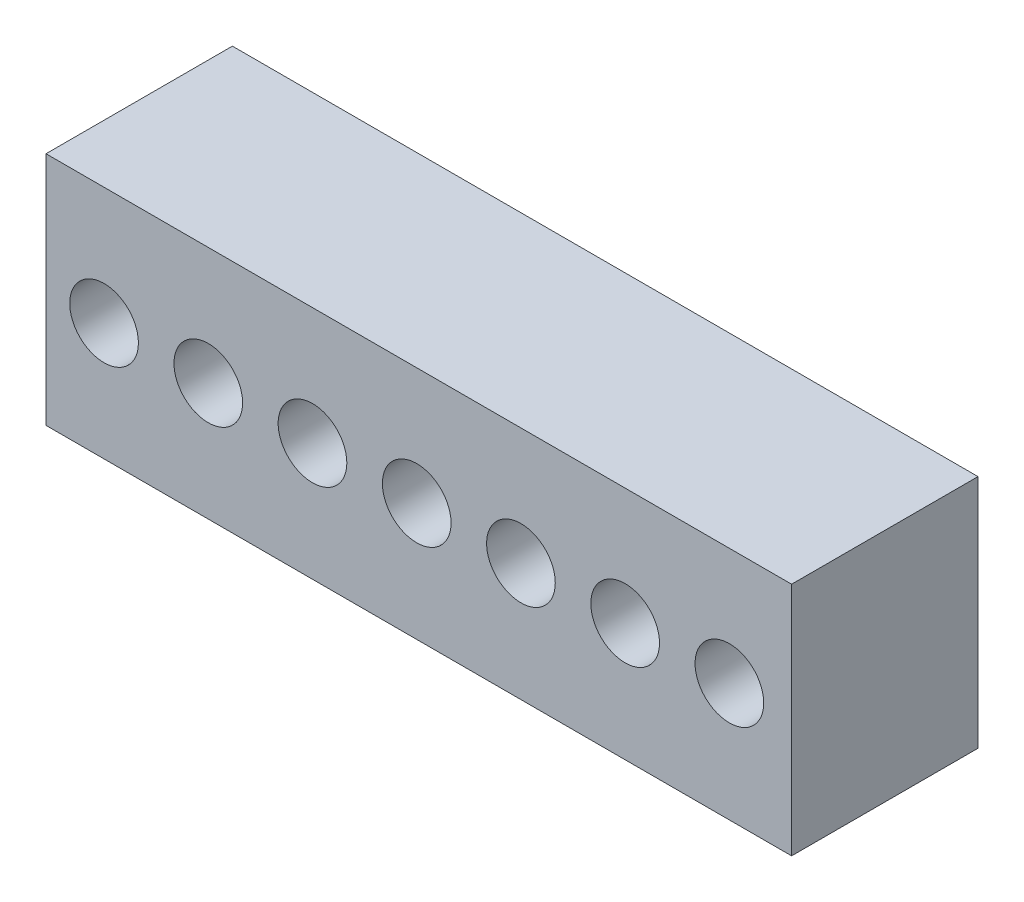
ISO-10303-21;
HEADER;
FILE_DESCRIPTION(('STEP AP214'),'2;1');
FILE_NAME('part.step','',(''),(''),'','','');
FILE_SCHEMA(('AUTOMOTIVE_DESIGN { 1 0 10303 214 1 1 1 1 }'));
ENDSEC;
DATA;
#1=APPLICATION_CONTEXT('core data for automotive mechanical design processes');
#2=APPLICATION_PROTOCOL_DEFINITION('international standard','automotive_design',2000,#1);
#3=PRODUCT_CONTEXT('',#1,'mechanical');
#4=PRODUCT('Part','Part','',(#3));
#5=PRODUCT_RELATED_PRODUCT_CATEGORY('part','',(#4));
#6=PRODUCT_DEFINITION_FORMATION('','',#4);
#7=PRODUCT_DEFINITION_CONTEXT('part definition',#1,'design');
#8=PRODUCT_DEFINITION('design','',#6,#7);
#9=PRODUCT_DEFINITION_SHAPE('','',#8);
#10=(LENGTH_UNIT() NAMED_UNIT(*) SI_UNIT(.MILLI.,.METRE.));
#11=(NAMED_UNIT(*) PLANE_ANGLE_UNIT() SI_UNIT($,.RADIAN.));
#12=(NAMED_UNIT(*) SI_UNIT($,.STERADIAN.) SOLID_ANGLE_UNIT());
#13=UNCERTAINTY_MEASURE_WITH_UNIT(LENGTH_MEASURE(1.E-05),#10,'distance_accuracy_value','');
#14=(GEOMETRIC_REPRESENTATION_CONTEXT(3) GLOBAL_UNCERTAINTY_ASSIGNED_CONTEXT((#13)) GLOBAL_UNIT_ASSIGNED_CONTEXT((#10,
#11,#12)) REPRESENTATION_CONTEXT('',''));
#15=CARTESIAN_POINT('',(0.,0.,0.));
#16=DIRECTION('',(0.,0.,1.));
#17=DIRECTION('',(1.,0.,0.));
#18=AXIS2_PLACEMENT_3D('',#15,#16,#17);
#19=CARTESIAN_POINT('',(0.,0.,4.));
#20=DIRECTION('',(0.,0.,-1.));
#21=DIRECTION('',(-1.,0.,0.));
#22=AXIS2_PLACEMENT_3D('',#19,#20,#21);
#23=PLANE('',#22);
#24=DIRECTION('',(0.,1.,0.));
#25=VECTOR('',#24,1.);
#26=CARTESIAN_POINT('',(0.,0.,4.));
#27=LINE('',#26,#25);
#28=CARTESIAN_POINT('',(0.,0.,4.));
#29=VERTEX_POINT('',#28);
#30=CARTESIAN_POINT('',(0.,5.04918032786885,4.));
#31=VERTEX_POINT('',#30);
#32=EDGE_CURVE('E209',#29,#31,#27,.T.);
#33=ORIENTED_EDGE('',*,*,#32,.F.);
#34=DIRECTION('',(1.,0.,0.));
#35=VECTOR('',#34,1.);
#36=CARTESIAN_POINT('',(0.,0.,4.));
#37=LINE('',#36,#35);
#38=CARTESIAN_POINT('',(16.,0.,4.));
#39=VERTEX_POINT('',#38);
#40=EDGE_CURVE('E196',#29,#39,#37,.T.);
#41=ORIENTED_EDGE('',*,*,#40,.T.);
#42=DIRECTION('',(0.,1.,0.));
#43=VECTOR('',#42,1.);
#44=CARTESIAN_POINT('',(16.,0.,4.));
#45=LINE('',#44,#43);
#46=CARTESIAN_POINT('',(16.,5.04918032786885,4.));
#47=VERTEX_POINT('',#46);
#48=EDGE_CURVE('E191',#39,#47,#45,.T.);
#49=ORIENTED_EDGE('',*,*,#48,.T.);
#50=DIRECTION('',(1.,0.,0.));
#51=VECTOR('',#50,1.);
#52=CARTESIAN_POINT('',(0.,5.04918032786885,4.));
#53=LINE('',#52,#51);
#54=EDGE_CURVE('E195',#31,#47,#53,.T.);
#55=ORIENTED_EDGE('',*,*,#54,.F.);
#56=EDGE_LOOP('',(#33,#41,#49,#55));
#57=FACE_BOUND('',#56,.T.);
#58=CARTESIAN_POINT('',(14.6648451995468,2.54088519098637,4.));
#59=DIRECTION('',(0.,0.,1.));
#60=DIRECTION('',(1.,0.,0.));
#61=AXIS2_PLACEMENT_3D('',#58,#59,#60);
#62=CIRCLE('',#61,0.736793608336558);
#63=CARTESIAN_POINT('',(15.4016388078834,2.54088519098637,4.));
#64=VERTEX_POINT('',#63);
#65=EDGE_CURVE('E222',#64,#64,#62,.T.);
#66=ORIENTED_EDGE('',*,*,#65,.F.);
#67=EDGE_LOOP('',(#66));
#68=FACE_BOUND('',#67,.T.);
#69=CARTESIAN_POINT('',(12.4283546061797,2.53816935314438,4.));
#70=DIRECTION('',(0.,0.,1.));
#71=DIRECTION('',(1.,0.,0.));
#72=AXIS2_PLACEMENT_3D('',#69,#70,#71);
#73=CIRCLE('',#72,0.736793608336445);
#74=CARTESIAN_POINT('',(13.1651482145161,2.53816935314438,4.));
#75=VERTEX_POINT('',#74);
#76=EDGE_CURVE('E270',#75,#75,#73,.T.);
#77=ORIENTED_EDGE('',*,*,#76,.F.);
#78=EDGE_LOOP('',(#77));
#79=FACE_BOUND('',#78,.T.);
#80=CARTESIAN_POINT('',(10.1918640128126,2.53545351530239,4.));
#81=DIRECTION('',(0.,0.,1.));
#82=DIRECTION('',(1.,0.,0.));
#83=AXIS2_PLACEMENT_3D('',#80,#81,#82);
#84=CIRCLE('',#83,0.73679360833633);
#85=CARTESIAN_POINT('',(10.9286576211489,2.53545351530239,4.));
#86=VERTEX_POINT('',#85);
#87=EDGE_CURVE('E280',#86,#86,#84,.T.);
#88=ORIENTED_EDGE('',*,*,#87,.F.);
#89=EDGE_LOOP('',(#88));
#90=FACE_BOUND('',#89,.T.);
#91=CARTESIAN_POINT('',(7.95537341944553,2.5327376774604,4.));
#92=DIRECTION('',(0.,0.,1.));
#93=DIRECTION('',(1.,0.,0.));
#94=AXIS2_PLACEMENT_3D('',#91,#92,#93);
#95=CIRCLE('',#94,0.736793608336216);
#96=CARTESIAN_POINT('',(8.69216702778174,2.5327376774604,4.));
#97=VERTEX_POINT('',#96);
#98=EDGE_CURVE('E286',#97,#97,#95,.T.);
#99=ORIENTED_EDGE('',*,*,#98,.F.);
#100=EDGE_LOOP('',(#99));
#101=FACE_BOUND('',#100,.T.);
#102=CARTESIAN_POINT('',(5.71888282607844,2.53002183961841,4.));
#103=DIRECTION('',(0.,0.,1.));
#104=DIRECTION('',(1.,0.,0.));
#105=AXIS2_PLACEMENT_3D('',#102,#103,#104);
#106=CIRCLE('',#105,0.736793608336103);
#107=CARTESIAN_POINT('',(6.45567643441454,2.53002183961841,4.));
#108=VERTEX_POINT('',#107);
#109=EDGE_CURVE('E294',#108,#108,#106,.T.);
#110=ORIENTED_EDGE('',*,*,#109,.F.);
#111=EDGE_LOOP('',(#110));
#112=FACE_BOUND('',#111,.T.);
#113=CARTESIAN_POINT('',(3.48239223271147,2.52730600177642,4.));
#114=DIRECTION('',(0.,0.,1.));
#115=DIRECTION('',(1.,0.,0.));
#116=AXIS2_PLACEMENT_3D('',#113,#114,#115);
#117=CIRCLE('',#116,0.736793608335875);
#118=CARTESIAN_POINT('',(4.21918584104734,2.52730600177642,4.));
#119=VERTEX_POINT('',#118);
#120=EDGE_CURVE('E302',#119,#119,#117,.T.);
#121=ORIENTED_EDGE('',*,*,#120,.F.);
#122=EDGE_LOOP('',(#121));
#123=FACE_BOUND('',#122,.T.);
#124=CARTESIAN_POINT('',(1.24590163934426,2.52459016393443,4.));
#125=DIRECTION('',(0.,0.,1.));
#126=DIRECTION('',(1.,0.,0.));
#127=AXIS2_PLACEMENT_3D('',#124,#125,#126);
#128=CIRCLE('',#127,0.736793608335875);
#129=CARTESIAN_POINT('',(1.98269524768013,2.52459016393443,4.));
#130=VERTEX_POINT('',#129);
#131=EDGE_CURVE('E310',#130,#130,#128,.T.);
#132=ORIENTED_EDGE('',*,*,#131,.F.);
#133=EDGE_LOOP('',(#132));
#134=FACE_BOUND('',#133,.T.);
#135=ADVANCED_FACE('F144',(#57,#68,#79,#90,#101,#112,#123,#134),#23,.F.);
#136=CARTESIAN_POINT('',(0.,0.,0.));
#137=DIRECTION('',(0.,0.,-1.));
#138=DIRECTION('',(-1.,0.,0.));
#139=AXIS2_PLACEMENT_3D('',#136,#137,#138);
#140=PLANE('',#139);
#141=CARTESIAN_POINT('',(3.48239223271147,2.52730600177642,0.));
#142=DIRECTION('',(0.,0.,1.));
#143=DIRECTION('',(1.,0.,0.));
#144=AXIS2_PLACEMENT_3D('',#141,#142,#143);
#145=CIRCLE('',#144,0.736793608335875);
#146=CARTESIAN_POINT('',(4.21918584104734,2.52730600177642,0.));
#147=VERTEX_POINT('',#146);
#148=EDGE_CURVE('E306',#147,#147,#145,.T.);
#149=ORIENTED_EDGE('',*,*,#148,.T.);
#150=EDGE_LOOP('',(#149));
#151=FACE_BOUND('',#150,.T.);
#152=CARTESIAN_POINT('',(7.95537341944553,2.5327376774604,0.));
#153=DIRECTION('',(0.,0.,1.));
#154=DIRECTION('',(1.,0.,0.));
#155=AXIS2_PLACEMENT_3D('',#152,#153,#154);
#156=CIRCLE('',#155,0.736793608336216);
#157=CARTESIAN_POINT('',(8.69216702778174,2.5327376774604,0.));
#158=VERTEX_POINT('',#157);
#159=EDGE_CURVE('E290',#158,#158,#156,.T.);
#160=ORIENTED_EDGE('',*,*,#159,.T.);
#161=EDGE_LOOP('',(#160));
#162=FACE_BOUND('',#161,.T.);
#163=CARTESIAN_POINT('',(12.4283546061797,2.53816935314438,0.));
#164=DIRECTION('',(0.,0.,1.));
#165=DIRECTION('',(1.,0.,0.));
#166=AXIS2_PLACEMENT_3D('',#163,#164,#165);
#167=CIRCLE('',#166,0.736793608336445);
#168=CARTESIAN_POINT('',(13.1651482145161,2.53816935314438,0.));
#169=VERTEX_POINT('',#168);
#170=EDGE_CURVE('E275',#169,#169,#167,.T.);
#171=ORIENTED_EDGE('',*,*,#170,.T.);
#172=EDGE_LOOP('',(#171));
#173=FACE_BOUND('',#172,.T.);
#174=DIRECTION('',(0.,1.,0.));
#175=VECTOR('',#174,1.);
#176=CARTESIAN_POINT('',(0.,0.,0.));
#177=LINE('',#176,#175);
#178=CARTESIAN_POINT('',(0.,0.,0.));
#179=VERTEX_POINT('',#178);
#180=CARTESIAN_POINT('',(0.,5.04918032786885,0.));
#181=VERTEX_POINT('',#180);
#182=EDGE_CURVE('E217',#179,#181,#177,.T.);
#183=ORIENTED_EDGE('',*,*,#182,.T.);
#184=DIRECTION('',(1.,0.,0.));
#185=VECTOR('',#184,1.);
#186=CARTESIAN_POINT('',(0.,5.04918032786885,0.));
#187=LINE('',#186,#185);
#188=CARTESIAN_POINT('',(16.,5.04918032786885,0.));
#189=VERTEX_POINT('',#188);
#190=EDGE_CURVE('E221',#181,#189,#187,.T.);
#191=ORIENTED_EDGE('',*,*,#190,.T.);
#192=DIRECTION('',(0.,1.,0.));
#193=VECTOR('',#192,1.);
#194=CARTESIAN_POINT('',(16.,0.,0.));
#195=LINE('',#194,#193);
#196=CARTESIAN_POINT('',(16.,0.,0.));
#197=VERTEX_POINT('',#196);
#198=EDGE_CURVE('E204',#197,#189,#195,.T.);
#199=ORIENTED_EDGE('',*,*,#198,.F.);
#200=DIRECTION('',(1.,0.,0.));
#201=VECTOR('',#200,1.);
#202=CARTESIAN_POINT('',(0.,0.,0.));
#203=LINE('',#202,#201);
#204=EDGE_CURVE('E179',#179,#197,#203,.T.);
#205=ORIENTED_EDGE('',*,*,#204,.F.);
#206=EDGE_LOOP('',(#183,#191,#199,#205));
#207=FACE_BOUND('',#206,.T.);
#208=CARTESIAN_POINT('',(14.6648451995468,2.54088519098637,0.));
#209=DIRECTION('',(0.,0.,1.));
#210=DIRECTION('',(1.,0.,0.));
#211=AXIS2_PLACEMENT_3D('',#208,#209,#210);
#212=CIRCLE('',#211,0.736793608336558);
#213=CARTESIAN_POINT('',(15.4016388078834,2.54088519098637,0.));
#214=VERTEX_POINT('',#213);
#215=EDGE_CURVE('E268',#214,#214,#212,.T.);
#216=ORIENTED_EDGE('',*,*,#215,.T.);
#217=EDGE_LOOP('',(#216));
#218=FACE_BOUND('',#217,.T.);
#219=CARTESIAN_POINT('',(10.1918640128126,2.53545351530239,0.));
#220=DIRECTION('',(0.,0.,1.));
#221=DIRECTION('',(1.,0.,0.));
#222=AXIS2_PLACEMENT_3D('',#219,#220,#221);
#223=CIRCLE('',#222,0.73679360833633);
#224=CARTESIAN_POINT('',(10.9286576211489,2.53545351530239,0.));
#225=VERTEX_POINT('',#224);
#226=EDGE_CURVE('E282',#225,#225,#223,.T.);
#227=ORIENTED_EDGE('',*,*,#226,.T.);
#228=EDGE_LOOP('',(#227));
#229=FACE_BOUND('',#228,.T.);
#230=CARTESIAN_POINT('',(5.71888282607844,2.53002183961841,0.));
#231=DIRECTION('',(0.,0.,1.));
#232=DIRECTION('',(1.,0.,0.));
#233=AXIS2_PLACEMENT_3D('',#230,#231,#232);
#234=CIRCLE('',#233,0.736793608336103);
#235=CARTESIAN_POINT('',(6.45567643441454,2.53002183961841,0.));
#236=VERTEX_POINT('',#235);
#237=EDGE_CURVE('E298',#236,#236,#234,.T.);
#238=ORIENTED_EDGE('',*,*,#237,.T.);
#239=EDGE_LOOP('',(#238));
#240=FACE_BOUND('',#239,.T.);
#241=CARTESIAN_POINT('',(1.24590163934426,2.52459016393443,0.));
#242=DIRECTION('',(0.,0.,1.));
#243=DIRECTION('',(1.,0.,0.));
#244=AXIS2_PLACEMENT_3D('',#241,#242,#243);
#245=CIRCLE('',#244,0.736793608335875);
#246=CARTESIAN_POINT('',(1.98269524768013,2.52459016393443,0.));
#247=VERTEX_POINT('',#246);
#248=EDGE_CURVE('E314',#247,#247,#245,.T.);
#249=ORIENTED_EDGE('',*,*,#248,.T.);
#250=EDGE_LOOP('',(#249));
#251=FACE_BOUND('',#250,.T.);
#252=ADVANCED_FACE('F231',(#151,#162,#173,#207,#218,#229,#240,#251),#140,.T.);
#253=CARTESIAN_POINT('',(0.,0.,4.));
#254=DIRECTION('',(-1.,0.,0.));
#255=DIRECTION('',(0.,0.,1.));
#256=AXIS2_PLACEMENT_3D('',#253,#254,#255);
#257=PLANE('',#256);
#258=ORIENTED_EDGE('',*,*,#182,.F.);
#259=DIRECTION('',(0.,0.,-1.));
#260=VECTOR('',#259,1.);
#261=CARTESIAN_POINT('',(0.,0.,4.));
#262=LINE('',#261,#260);
#263=EDGE_CURVE('E12',#29,#179,#262,.T.);
#264=ORIENTED_EDGE('',*,*,#263,.F.);
#265=ORIENTED_EDGE('',*,*,#32,.T.);
#266=DIRECTION('',(0.,0.,-1.));
#267=VECTOR('',#266,1.);
#268=CARTESIAN_POINT('',(0.,5.04918032786885,4.));
#269=LINE('',#268,#267);
#270=EDGE_CURVE('E148',#31,#181,#269,.T.);
#271=ORIENTED_EDGE('',*,*,#270,.T.);
#272=EDGE_LOOP('',(#258,#264,#265,#271));
#273=FACE_BOUND('',#272,.T.);
#274=ADVANCED_FACE('F146',(#273),#257,.T.);
#275=CARTESIAN_POINT('',(0.,0.,4.));
#276=DIRECTION('',(0.,1.,0.));
#277=DIRECTION('',(0.,0.,1.));
#278=AXIS2_PLACEMENT_3D('',#275,#276,#277);
#279=PLANE('',#278);
#280=ORIENTED_EDGE('',*,*,#204,.T.);
#281=DIRECTION('',(0.,0.,-1.));
#282=VECTOR('',#281,1.);
#283=CARTESIAN_POINT('',(16.,0.,4.));
#284=LINE('',#283,#282);
#285=EDGE_CURVE('E155',#39,#197,#284,.T.);
#286=ORIENTED_EDGE('',*,*,#285,.F.);
#287=ORIENTED_EDGE('',*,*,#40,.F.);
#288=ORIENTED_EDGE('',*,*,#263,.T.);
#289=EDGE_LOOP('',(#280,#286,#287,#288));
#290=FACE_BOUND('',#289,.T.);
#291=ADVANCED_FACE('F235',(#290),#279,.F.);
#292=CARTESIAN_POINT('',(16.,0.,4.));
#293=DIRECTION('',(-1.,0.,0.));
#294=DIRECTION('',(0.,0.,1.));
#295=AXIS2_PLACEMENT_3D('',#292,#293,#294);
#296=PLANE('',#295);
#297=ORIENTED_EDGE('',*,*,#198,.T.);
#298=DIRECTION('',(0.,0.,-1.));
#299=VECTOR('',#298,1.);
#300=CARTESIAN_POINT('',(16.,5.04918032786885,4.));
#301=LINE('',#300,#299);
#302=EDGE_CURVE('E201',#47,#189,#301,.T.);
#303=ORIENTED_EDGE('',*,*,#302,.F.);
#304=ORIENTED_EDGE('',*,*,#48,.F.);
#305=ORIENTED_EDGE('',*,*,#285,.T.);
#306=EDGE_LOOP('',(#297,#303,#304,#305));
#307=FACE_BOUND('',#306,.T.);
#308=ADVANCED_FACE('F202',(#307),#296,.F.);
#309=CARTESIAN_POINT('',(0.,5.04918032786885,4.));
#310=DIRECTION('',(0.,1.,0.));
#311=DIRECTION('',(0.,0.,1.));
#312=AXIS2_PLACEMENT_3D('',#309,#310,#311);
#313=PLANE('',#312);
#314=ORIENTED_EDGE('',*,*,#190,.F.);
#315=ORIENTED_EDGE('',*,*,#270,.F.);
#316=ORIENTED_EDGE('',*,*,#54,.T.);
#317=ORIENTED_EDGE('',*,*,#302,.T.);
#318=EDGE_LOOP('',(#314,#315,#316,#317));
#319=FACE_BOUND('',#318,.T.);
#320=ADVANCED_FACE('F207',(#319),#313,.T.);
#321=CARTESIAN_POINT('',(14.6648451995468,2.54088519098637,4.));
#322=DIRECTION('',(0.,0.,-1.));
#323=DIRECTION('',(-1.,0.,0.));
#324=AXIS2_PLACEMENT_3D('',#321,#322,#323);
#325=CYLINDRICAL_SURFACE('',#324,0.736793608336558);
#326=ORIENTED_EDGE('',*,*,#65,.T.);
#327=EDGE_LOOP('',(#326));
#328=FACE_BOUND('',#327,.T.);
#329=ORIENTED_EDGE('',*,*,#215,.F.);
#330=EDGE_LOOP('',(#329));
#331=FACE_BOUND('',#330,.T.);
#332=ADVANCED_FACE('F248',(#328,#331),#325,.F.);
#333=CARTESIAN_POINT('',(12.4283546061797,2.53816935314438,4.));
#334=DIRECTION('',(0.,0.,-1.));
#335=DIRECTION('',(-1.,0.,0.));
#336=AXIS2_PLACEMENT_3D('',#333,#334,#335);
#337=CYLINDRICAL_SURFACE('',#336,0.736793608336445);
#338=ORIENTED_EDGE('',*,*,#76,.T.);
#339=EDGE_LOOP('',(#338));
#340=FACE_BOUND('',#339,.T.);
#341=ORIENTED_EDGE('',*,*,#170,.F.);
#342=EDGE_LOOP('',(#341));
#343=FACE_BOUND('',#342,.T.);
#344=ADVANCED_FACE('F256',(#340,#343),#337,.F.);
#345=CARTESIAN_POINT('',(10.1918640128126,2.53545351530239,4.));
#346=DIRECTION('',(0.,0.,-1.));
#347=DIRECTION('',(-1.,0.,0.));
#348=AXIS2_PLACEMENT_3D('',#345,#346,#347);
#349=CYLINDRICAL_SURFACE('',#348,0.73679360833633);
#350=ORIENTED_EDGE('',*,*,#87,.T.);
#351=EDGE_LOOP('',(#350));
#352=FACE_BOUND('',#351,.T.);
#353=ORIENTED_EDGE('',*,*,#226,.F.);
#354=EDGE_LOOP('',(#353));
#355=FACE_BOUND('',#354,.T.);
#356=ADVANCED_FACE('F261',(#352,#355),#349,.F.);
#357=CARTESIAN_POINT('',(7.95537341944553,2.5327376774604,4.));
#358=DIRECTION('',(0.,0.,-1.));
#359=DIRECTION('',(-1.,0.,0.));
#360=AXIS2_PLACEMENT_3D('',#357,#358,#359);
#361=CYLINDRICAL_SURFACE('',#360,0.736793608336216);
#362=ORIENTED_EDGE('',*,*,#98,.T.);
#363=EDGE_LOOP('',(#362));
#364=FACE_BOUND('',#363,.T.);
#365=ORIENTED_EDGE('',*,*,#159,.F.);
#366=EDGE_LOOP('',(#365));
#367=FACE_BOUND('',#366,.T.);
#368=ADVANCED_FACE('F339',(#364,#367),#361,.F.);
#369=CARTESIAN_POINT('',(5.71888282607844,2.53002183961841,4.));
#370=DIRECTION('',(0.,0.,-1.));
#371=DIRECTION('',(-1.,0.,0.));
#372=AXIS2_PLACEMENT_3D('',#369,#370,#371);
#373=CYLINDRICAL_SURFACE('',#372,0.736793608336103);
#374=ORIENTED_EDGE('',*,*,#109,.T.);
#375=EDGE_LOOP('',(#374));
#376=FACE_BOUND('',#375,.T.);
#377=ORIENTED_EDGE('',*,*,#237,.F.);
#378=EDGE_LOOP('',(#377));
#379=FACE_BOUND('',#378,.T.);
#380=ADVANCED_FACE('F333',(#376,#379),#373,.F.);
#381=CARTESIAN_POINT('',(3.48239223271147,2.52730600177642,4.));
#382=DIRECTION('',(0.,0.,-1.));
#383=DIRECTION('',(-1.,0.,0.));
#384=AXIS2_PLACEMENT_3D('',#381,#382,#383);
#385=CYLINDRICAL_SURFACE('',#384,0.736793608335875);
#386=ORIENTED_EDGE('',*,*,#120,.T.);
#387=EDGE_LOOP('',(#386));
#388=FACE_BOUND('',#387,.T.);
#389=ORIENTED_EDGE('',*,*,#148,.F.);
#390=EDGE_LOOP('',(#389));
#391=FACE_BOUND('',#390,.T.);
#392=ADVANCED_FACE('F326',(#388,#391),#385,.F.);
#393=CARTESIAN_POINT('',(1.24590163934426,2.52459016393443,4.));
#394=DIRECTION('',(0.,0.,-1.));
#395=DIRECTION('',(-1.,0.,0.));
#396=AXIS2_PLACEMENT_3D('',#393,#394,#395);
#397=CYLINDRICAL_SURFACE('',#396,0.736793608335875);
#398=ORIENTED_EDGE('',*,*,#131,.T.);
#399=EDGE_LOOP('',(#398));
#400=FACE_BOUND('',#399,.T.);
#401=ORIENTED_EDGE('',*,*,#248,.F.);
#402=EDGE_LOOP('',(#401));
#403=FACE_BOUND('',#402,.T.);
#404=ADVANCED_FACE('F322',(#400,#403),#397,.F.);
#405=CLOSED_SHELL('',(#135,#252,#274,#291,#308,#320,#332,#344,#356,#368,#380,#392,#404));
#406=MANIFOLD_SOLID_BREP('B2',#405);
#407=ADVANCED_BREP_SHAPE_REPRESENTATION('',(#18,#406),#14);
#408=SHAPE_DEFINITION_REPRESENTATION(#9,#407);
ENDSEC;
END-ISO-10303-21;
